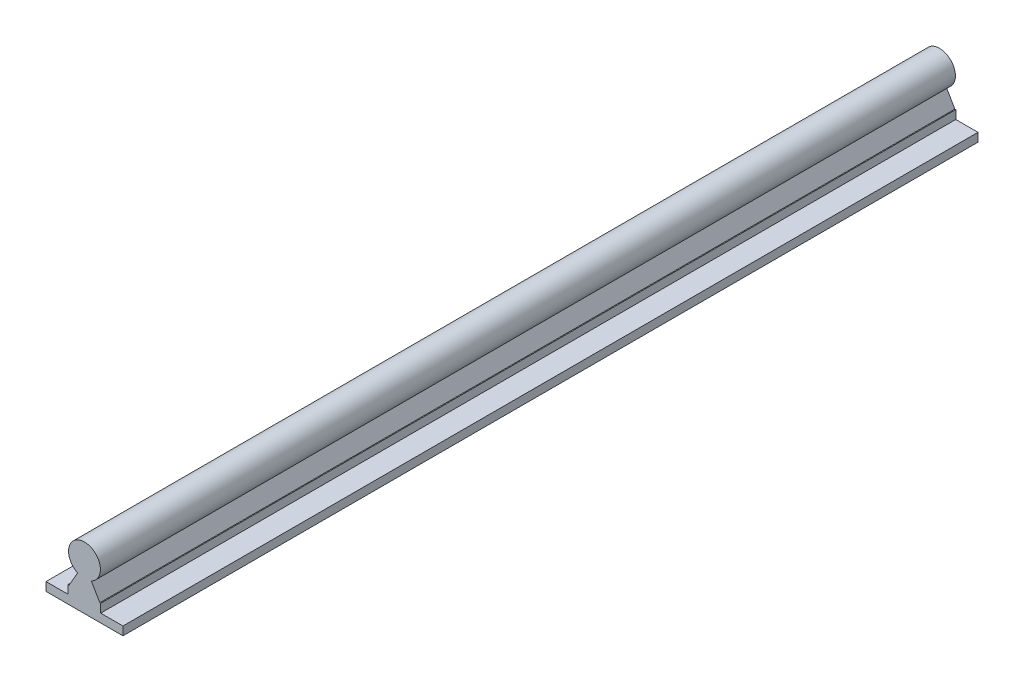
ISO-10303-21;
HEADER;
FILE_DESCRIPTION(('STEP AP214'),'2;1');
FILE_NAME('part.step','',(''),(''),'','','');
FILE_SCHEMA(('AUTOMOTIVE_DESIGN { 1 0 10303 214 1 1 1 1 }'));
ENDSEC;
DATA;
#1=APPLICATION_CONTEXT('core data for automotive mechanical design processes');
#2=APPLICATION_PROTOCOL_DEFINITION('international standard','automotive_design',2000,#1);
#3=PRODUCT_CONTEXT('',#1,'mechanical');
#4=PRODUCT('Part','Part','',(#3));
#5=PRODUCT_RELATED_PRODUCT_CATEGORY('part','',(#4));
#6=PRODUCT_DEFINITION_FORMATION('','',#4);
#7=PRODUCT_DEFINITION_CONTEXT('part definition',#1,'design');
#8=PRODUCT_DEFINITION('design','',#6,#7);
#9=PRODUCT_DEFINITION_SHAPE('','',#8);
#10=(LENGTH_UNIT() NAMED_UNIT(*) SI_UNIT(.MILLI.,.METRE.));
#11=(NAMED_UNIT(*) PLANE_ANGLE_UNIT() SI_UNIT($,.RADIAN.));
#12=(NAMED_UNIT(*) SI_UNIT($,.STERADIAN.) SOLID_ANGLE_UNIT());
#13=UNCERTAINTY_MEASURE_WITH_UNIT(LENGTH_MEASURE(1.E-05),#10,'distance_accuracy_value','');
#14=(GEOMETRIC_REPRESENTATION_CONTEXT(3) GLOBAL_UNCERTAINTY_ASSIGNED_CONTEXT((#13)) GLOBAL_UNIT_ASSIGNED_CONTEXT((#10,
#11,#12)) REPRESENTATION_CONTEXT('',''));
#15=CARTESIAN_POINT('',(0.,0.,0.));
#16=DIRECTION('',(0.,0.,1.));
#17=DIRECTION('',(1.,0.,0.));
#18=AXIS2_PLACEMENT_3D('',#15,#16,#17);
#19=CARTESIAN_POINT('',(-22.5,5.,500.));
#20=DIRECTION('',(1.,0.,0.));
#21=DIRECTION('',(0.,0.,-1.));
#22=AXIS2_PLACEMENT_3D('',#19,#20,#21);
#23=PLANE('',#22);
#24=DIRECTION('',(0.,-1.,0.));
#25=VECTOR('',#24,1.);
#26=CARTESIAN_POINT('',(-22.5,5.,0.));
#27=LINE('',#26,#25);
#28=CARTESIAN_POINT('',(-22.5,5.,0.));
#29=VERTEX_POINT('',#28);
#30=CARTESIAN_POINT('',(-22.5,0.,0.));
#31=VERTEX_POINT('',#30);
#32=EDGE_CURVE('E153',#29,#31,#27,.T.);
#33=ORIENTED_EDGE('',*,*,#32,.T.);
#34=DIRECTION('',(0.,0.,-1.));
#35=VECTOR('',#34,1.);
#36=CARTESIAN_POINT('',(-22.5,0.,500.));
#37=LINE('',#36,#35);
#38=CARTESIAN_POINT('',(-22.5,0.,500.));
#39=VERTEX_POINT('',#38);
#40=EDGE_CURVE('E11',#39,#31,#37,.T.);
#41=ORIENTED_EDGE('',*,*,#40,.F.);
#42=DIRECTION('',(0.,-1.,0.));
#43=VECTOR('',#42,1.);
#44=CARTESIAN_POINT('',(-22.5,5.,500.));
#45=LINE('',#44,#43);
#46=CARTESIAN_POINT('',(-22.5,5.,500.));
#47=VERTEX_POINT('',#46);
#48=EDGE_CURVE('E175',#47,#39,#45,.T.);
#49=ORIENTED_EDGE('',*,*,#48,.F.);
#50=DIRECTION('',(0.,0.,-1.));
#51=VECTOR('',#50,1.);
#52=CARTESIAN_POINT('',(-22.5,5.,500.));
#53=LINE('',#52,#51);
#54=EDGE_CURVE('E149',#47,#29,#53,.T.);
#55=ORIENTED_EDGE('',*,*,#54,.T.);
#56=EDGE_LOOP('',(#33,#41,#49,#55));
#57=FACE_BOUND('',#56,.T.);
#58=ADVANCED_FACE('F33',(#57),#23,.F.);
#59=CARTESIAN_POINT('',(-22.5,0.,500.));
#60=DIRECTION('',(0.,1.,0.));
#61=DIRECTION('',(0.,0.,1.));
#62=AXIS2_PLACEMENT_3D('',#59,#60,#61);
#63=PLANE('',#62);
#64=DIRECTION('',(1.,0.,0.));
#65=VECTOR('',#64,1.);
#66=CARTESIAN_POINT('',(-22.5,0.,0.));
#67=LINE('',#66,#65);
#68=CARTESIAN_POINT('',(22.5,0.,0.));
#69=VERTEX_POINT('',#68);
#70=EDGE_CURVE('E156',#31,#69,#67,.T.);
#71=ORIENTED_EDGE('',*,*,#70,.T.);
#72=DIRECTION('',(0.,0.,-1.));
#73=VECTOR('',#72,1.);
#74=CARTESIAN_POINT('',(22.5,0.,500.));
#75=LINE('',#74,#73);
#76=CARTESIAN_POINT('',(22.5,0.,500.));
#77=VERTEX_POINT('',#76);
#78=EDGE_CURVE('E41',#77,#69,#75,.T.);
#79=ORIENTED_EDGE('',*,*,#78,.F.);
#80=DIRECTION('',(1.,0.,0.));
#81=VECTOR('',#80,1.);
#82=CARTESIAN_POINT('',(-22.5,0.,500.));
#83=LINE('',#82,#81);
#84=EDGE_CURVE('E104',#39,#77,#83,.T.);
#85=ORIENTED_EDGE('',*,*,#84,.F.);
#86=ORIENTED_EDGE('',*,*,#40,.T.);
#87=EDGE_LOOP('',(#71,#79,#85,#86));
#88=FACE_BOUND('',#87,.T.);
#89=ADVANCED_FACE('F253',(#88),#63,.F.);
#90=CARTESIAN_POINT('',(22.5,0.,500.));
#91=DIRECTION('',(-1.,0.,0.));
#92=DIRECTION('',(0.,0.,1.));
#93=AXIS2_PLACEMENT_3D('',#90,#91,#92);
#94=PLANE('',#93);
#95=DIRECTION('',(0.,1.,0.));
#96=VECTOR('',#95,1.);
#97=CARTESIAN_POINT('',(22.5,0.,0.));
#98=LINE('',#97,#96);
#99=CARTESIAN_POINT('',(22.5,5.,0.));
#100=VERTEX_POINT('',#99);
#101=EDGE_CURVE('E158',#69,#100,#98,.T.);
#102=ORIENTED_EDGE('',*,*,#101,.T.);
#103=DIRECTION('',(0.,0.,-1.));
#104=VECTOR('',#103,1.);
#105=CARTESIAN_POINT('',(22.5,5.,500.));
#106=LINE('',#105,#104);
#107=CARTESIAN_POINT('',(22.5,5.,500.));
#108=VERTEX_POINT('',#107);
#109=EDGE_CURVE('E194',#108,#100,#106,.T.);
#110=ORIENTED_EDGE('',*,*,#109,.F.);
#111=DIRECTION('',(0.,1.,0.));
#112=VECTOR('',#111,1.);
#113=CARTESIAN_POINT('',(22.5,0.,500.));
#114=LINE('',#113,#112);
#115=EDGE_CURVE('E202',#77,#108,#114,.T.);
#116=ORIENTED_EDGE('',*,*,#115,.F.);
#117=ORIENTED_EDGE('',*,*,#78,.T.);
#118=EDGE_LOOP('',(#102,#110,#116,#117));
#119=FACE_BOUND('',#118,.T.);
#120=ADVANCED_FACE('F200',(#119),#94,.F.);
#121=CARTESIAN_POINT('',(22.5,5.,500.));
#122=DIRECTION('',(0.,-1.,0.));
#123=DIRECTION('',(1.,0.,0.));
#124=AXIS2_PLACEMENT_3D('',#121,#122,#123);
#125=PLANE('',#124);
#126=DIRECTION('',(-1.,0.,0.));
#127=VECTOR('',#126,1.);
#128=CARTESIAN_POINT('',(22.5,5.,0.));
#129=LINE('',#128,#127);
#130=CARTESIAN_POINT('',(9.5,4.99999999999999,0.));
#131=VERTEX_POINT('',#130);
#132=EDGE_CURVE('E160',#100,#131,#129,.T.);
#133=ORIENTED_EDGE('',*,*,#132,.T.);
#134=DIRECTION('',(0.,0.,-1.));
#135=VECTOR('',#134,1.);
#136=CARTESIAN_POINT('',(9.5,4.99999999999999,500.));
#137=LINE('',#136,#135);
#138=CARTESIAN_POINT('',(9.5,4.99999999999999,500.));
#139=VERTEX_POINT('',#138);
#140=EDGE_CURVE('E191',#139,#131,#137,.T.);
#141=ORIENTED_EDGE('',*,*,#140,.F.);
#142=DIRECTION('',(-1.,0.,0.));
#143=VECTOR('',#142,1.);
#144=CARTESIAN_POINT('',(22.5,5.,500.));
#145=LINE('',#144,#143);
#146=EDGE_CURVE('E220',#108,#139,#145,.T.);
#147=ORIENTED_EDGE('',*,*,#146,.F.);
#148=ORIENTED_EDGE('',*,*,#109,.T.);
#149=EDGE_LOOP('',(#133,#141,#147,#148));
#150=FACE_BOUND('',#149,.T.);
#151=ADVANCED_FACE('F211',(#150),#125,.F.);
#152=CARTESIAN_POINT('',(9.5,4.99999999999999,500.));
#153=DIRECTION('',(-1.,0.,0.));
#154=DIRECTION('',(0.,-1.,0.));
#155=AXIS2_PLACEMENT_3D('',#152,#153,#154);
#156=PLANE('',#155);
#157=DIRECTION('',(0.,1.,0.));
#158=VECTOR('',#157,1.);
#159=CARTESIAN_POINT('',(9.5,4.99999999999999,0.));
#160=LINE('',#159,#158);
#161=CARTESIAN_POINT('',(9.5,9.99999999999999,0.));
#162=VERTEX_POINT('',#161);
#163=EDGE_CURVE('E162',#131,#162,#160,.T.);
#164=ORIENTED_EDGE('',*,*,#163,.T.);
#165=DIRECTION('',(0.,0.,-1.));
#166=VECTOR('',#165,1.);
#167=CARTESIAN_POINT('',(9.5,9.99999999999999,500.));
#168=LINE('',#167,#166);
#169=CARTESIAN_POINT('',(9.5,9.99999999999999,500.));
#170=VERTEX_POINT('',#169);
#171=EDGE_CURVE('E188',#170,#162,#168,.T.);
#172=ORIENTED_EDGE('',*,*,#171,.F.);
#173=DIRECTION('',(0.,1.,0.));
#174=VECTOR('',#173,1.);
#175=CARTESIAN_POINT('',(9.5,4.99999999999999,500.));
#176=LINE('',#175,#174);
#177=EDGE_CURVE('E217',#139,#170,#176,.T.);
#178=ORIENTED_EDGE('',*,*,#177,.F.);
#179=ORIENTED_EDGE('',*,*,#140,.T.);
#180=EDGE_LOOP('',(#164,#172,#178,#179));
#181=FACE_BOUND('',#180,.T.);
#182=ADVANCED_FACE('F215',(#181),#156,.F.);
#183=CARTESIAN_POINT('',(9.5,9.99999999999999,500.));
#184=DIRECTION('',(0.,-1.,0.));
#185=DIRECTION('',(1.,0.,0.));
#186=AXIS2_PLACEMENT_3D('',#183,#184,#185);
#187=PLANE('',#186);
#188=DIRECTION('',(-1.,0.,0.));
#189=VECTOR('',#188,1.);
#190=CARTESIAN_POINT('',(9.5,9.99999999999999,0.));
#191=LINE('',#190,#189);
#192=CARTESIAN_POINT('',(8.967618538082,9.99999999999999,0.));
#193=VERTEX_POINT('',#192);
#194=EDGE_CURVE('E164',#162,#193,#191,.T.);
#195=ORIENTED_EDGE('',*,*,#194,.T.);
#196=DIRECTION('',(0.,0.,-1.));
#197=VECTOR('',#196,1.);
#198=CARTESIAN_POINT('',(8.967618538082,9.99999999999999,500.));
#199=LINE('',#198,#197);
#200=CARTESIAN_POINT('',(8.967618538082,9.99999999999999,500.));
#201=VERTEX_POINT('',#200);
#202=EDGE_CURVE('E185',#201,#193,#199,.T.);
#203=ORIENTED_EDGE('',*,*,#202,.F.);
#204=DIRECTION('',(-1.,0.,0.));
#205=VECTOR('',#204,1.);
#206=CARTESIAN_POINT('',(9.5,9.99999999999999,500.));
#207=LINE('',#206,#205);
#208=EDGE_CURVE('E219',#170,#201,#207,.T.);
#209=ORIENTED_EDGE('',*,*,#208,.F.);
#210=ORIENTED_EDGE('',*,*,#171,.T.);
#211=EDGE_LOOP('',(#195,#203,#209,#210));
#212=FACE_BOUND('',#211,.T.);
#213=ADVANCED_FACE('F266',(#212),#187,.F.);
#214=CARTESIAN_POINT('',(8.967618538082,9.99999999999999,500.));
#215=DIRECTION('',(-0.866025403784439,-0.5,0.));
#216=DIRECTION('',(0.5,-0.866025403784439,0.));
#217=AXIS2_PLACEMENT_3D('',#214,#215,#216);
#218=PLANE('',#217);
#219=DIRECTION('',(-0.5,0.866025403784439,0.));
#220=VECTOR('',#219,1.);
#221=CARTESIAN_POINT('',(8.967618538082,9.99999999999999,0.));
#222=LINE('',#221,#220);
#223=CARTESIAN_POINT('',(4.,18.6041677005791,0.));
#224=VERTEX_POINT('',#223);
#225=EDGE_CURVE('E166',#193,#224,#222,.T.);
#226=ORIENTED_EDGE('',*,*,#225,.T.);
#227=DIRECTION('',(0.,0.,-1.));
#228=VECTOR('',#227,1.);
#229=CARTESIAN_POINT('',(4.,18.6041677005791,500.));
#230=LINE('',#229,#228);
#231=CARTESIAN_POINT('',(4.,18.6041677005791,500.));
#232=VERTEX_POINT('',#231);
#233=EDGE_CURVE('E182',#232,#224,#230,.T.);
#234=ORIENTED_EDGE('',*,*,#233,.F.);
#235=DIRECTION('',(-0.5,0.866025403784439,0.));
#236=VECTOR('',#235,1.);
#237=CARTESIAN_POINT('',(8.967618538082,9.99999999999999,500.));
#238=LINE('',#237,#236);
#239=EDGE_CURVE('E222',#201,#232,#238,.T.);
#240=ORIENTED_EDGE('',*,*,#239,.F.);
#241=ORIENTED_EDGE('',*,*,#202,.T.);
#242=EDGE_LOOP('',(#226,#234,#240,#241));
#243=FACE_BOUND('',#242,.T.);
#244=ADVANCED_FACE('F269',(#243),#218,.F.);
#245=CARTESIAN_POINT('',(0.,27.,500.));
#246=DIRECTION('',(0.,0.,-1.));
#247=DIRECTION('',(-1.,0.,0.));
#248=AXIS2_PLACEMENT_3D('',#245,#246,#247);
#249=CYLINDRICAL_SURFACE('',#248,9.3);
#250=CARTESIAN_POINT('',(0.,27.,0.));
#251=DIRECTION('',(0.,0.,1.));
#252=DIRECTION('',(1.,0.,0.));
#253=AXIS2_PLACEMENT_3D('',#250,#251,#252);
#254=CIRCLE('',#253,9.3);
#255=CARTESIAN_POINT('',(-4.00000000000001,18.6041677005791,0.));
#256=VERTEX_POINT('',#255);
#257=EDGE_CURVE('E168',#224,#256,#254,.T.);
#258=ORIENTED_EDGE('',*,*,#257,.T.);
#259=DIRECTION('',(0.,0.,-1.));
#260=VECTOR('',#259,1.);
#261=CARTESIAN_POINT('',(-4.00000000000001,18.6041677005791,500.));
#262=LINE('',#261,#260);
#263=CARTESIAN_POINT('',(-4.00000000000001,18.6041677005791,500.));
#264=VERTEX_POINT('',#263);
#265=EDGE_CURVE('E179',#264,#256,#262,.T.);
#266=ORIENTED_EDGE('',*,*,#265,.F.);
#267=CARTESIAN_POINT('',(0.,27.,500.));
#268=DIRECTION('',(0.,0.,1.));
#269=DIRECTION('',(1.,0.,0.));
#270=AXIS2_PLACEMENT_3D('',#267,#268,#269);
#271=CIRCLE('',#270,9.3);
#272=EDGE_CURVE('E228',#232,#264,#271,.T.);
#273=ORIENTED_EDGE('',*,*,#272,.F.);
#274=ORIENTED_EDGE('',*,*,#233,.T.);
#275=EDGE_LOOP('',(#258,#266,#273,#274));
#276=FACE_BOUND('',#275,.T.);
#277=ADVANCED_FACE('F234',(#276),#249,.T.);
#278=CARTESIAN_POINT('',(-4.00000000000001,18.6041677005791,500.));
#279=DIRECTION('',(0.866025403784439,-0.5,0.));
#280=DIRECTION('',(0.5,0.866025403784439,0.));
#281=AXIS2_PLACEMENT_3D('',#278,#279,#280);
#282=PLANE('',#281);
#283=DIRECTION('',(-0.5,-0.866025403784439,0.));
#284=VECTOR('',#283,1.);
#285=CARTESIAN_POINT('',(-4.00000000000001,18.6041677005791,0.));
#286=LINE('',#285,#284);
#287=CARTESIAN_POINT('',(-8.96761853808201,10.,0.));
#288=VERTEX_POINT('',#287);
#289=EDGE_CURVE('E170',#256,#288,#286,.T.);
#290=ORIENTED_EDGE('',*,*,#289,.T.);
#291=DIRECTION('',(0.,0.,-1.));
#292=VECTOR('',#291,1.);
#293=CARTESIAN_POINT('',(-8.96761853808201,10.,500.));
#294=LINE('',#293,#292);
#295=CARTESIAN_POINT('',(-8.96761853808201,10.,500.));
#296=VERTEX_POINT('',#295);
#297=EDGE_CURVE('E144',#296,#288,#294,.T.);
#298=ORIENTED_EDGE('',*,*,#297,.F.);
#299=DIRECTION('',(-0.5,-0.866025403784439,0.));
#300=VECTOR('',#299,1.);
#301=CARTESIAN_POINT('',(-4.00000000000001,18.6041677005791,500.));
#302=LINE('',#301,#300);
#303=EDGE_CURVE('E135',#264,#296,#302,.T.);
#304=ORIENTED_EDGE('',*,*,#303,.F.);
#305=ORIENTED_EDGE('',*,*,#265,.T.);
#306=EDGE_LOOP('',(#290,#298,#304,#305));
#307=FACE_BOUND('',#306,.T.);
#308=ADVANCED_FACE('F238',(#307),#282,.F.);
#309=CARTESIAN_POINT('',(-8.96761853808201,10.,500.));
#310=DIRECTION('',(0.,-1.,0.));
#311=DIRECTION('',(0.,0.,-1.));
#312=AXIS2_PLACEMENT_3D('',#309,#310,#311);
#313=PLANE('',#312);
#314=DIRECTION('',(-1.,0.,0.));
#315=VECTOR('',#314,1.);
#316=CARTESIAN_POINT('',(-8.96761853808201,10.,0.));
#317=LINE('',#316,#315);
#318=CARTESIAN_POINT('',(-9.50000000000001,10.,0.));
#319=VERTEX_POINT('',#318);
#320=EDGE_CURVE('E143',#288,#319,#317,.T.);
#321=ORIENTED_EDGE('',*,*,#320,.T.);
#322=DIRECTION('',(0.,0.,-1.));
#323=VECTOR('',#322,1.);
#324=CARTESIAN_POINT('',(-9.50000000000001,10.,500.));
#325=LINE('',#324,#323);
#326=CARTESIAN_POINT('',(-9.50000000000001,10.,500.));
#327=VERTEX_POINT('',#326);
#328=EDGE_CURVE('E140',#327,#319,#325,.T.);
#329=ORIENTED_EDGE('',*,*,#328,.F.);
#330=DIRECTION('',(-1.,0.,0.));
#331=VECTOR('',#330,1.);
#332=CARTESIAN_POINT('',(-8.96761853808201,10.,500.));
#333=LINE('',#332,#331);
#334=EDGE_CURVE('E129',#296,#327,#333,.T.);
#335=ORIENTED_EDGE('',*,*,#334,.F.);
#336=ORIENTED_EDGE('',*,*,#297,.T.);
#337=EDGE_LOOP('',(#321,#329,#335,#336));
#338=FACE_BOUND('',#337,.T.);
#339=ADVANCED_FACE('F141',(#338),#313,.F.);
#340=CARTESIAN_POINT('',(-9.50000000000001,10.,500.));
#341=DIRECTION('',(1.,0.,0.));
#342=DIRECTION('',(0.,1.,0.));
#343=AXIS2_PLACEMENT_3D('',#340,#341,#342);
#344=PLANE('',#343);
#345=DIRECTION('',(0.,-1.,0.));
#346=VECTOR('',#345,1.);
#347=CARTESIAN_POINT('',(-9.50000000000001,10.,0.));
#348=LINE('',#347,#346);
#349=CARTESIAN_POINT('',(-9.5,5.,0.));
#350=VERTEX_POINT('',#349);
#351=EDGE_CURVE('E90',#319,#350,#348,.T.);
#352=ORIENTED_EDGE('',*,*,#351,.T.);
#353=DIRECTION('',(0.,0.,-1.));
#354=VECTOR('',#353,1.);
#355=CARTESIAN_POINT('',(-9.5,5.,500.));
#356=LINE('',#355,#354);
#357=CARTESIAN_POINT('',(-9.5,5.,500.));
#358=VERTEX_POINT('',#357);
#359=EDGE_CURVE('E145',#358,#350,#356,.T.);
#360=ORIENTED_EDGE('',*,*,#359,.F.);
#361=DIRECTION('',(0.,-1.,0.));
#362=VECTOR('',#361,1.);
#363=CARTESIAN_POINT('',(-9.50000000000001,10.,500.));
#364=LINE('',#363,#362);
#365=EDGE_CURVE('E133',#327,#358,#364,.T.);
#366=ORIENTED_EDGE('',*,*,#365,.F.);
#367=ORIENTED_EDGE('',*,*,#328,.T.);
#368=EDGE_LOOP('',(#352,#360,#366,#367));
#369=FACE_BOUND('',#368,.T.);
#370=ADVANCED_FACE('F147',(#369),#344,.F.);
#371=CARTESIAN_POINT('',(-9.5,5.,500.));
#372=DIRECTION('',(0.,-1.,0.));
#373=DIRECTION('',(1.,0.,0.));
#374=AXIS2_PLACEMENT_3D('',#371,#372,#373);
#375=PLANE('',#374);
#376=DIRECTION('',(-1.,0.,0.));
#377=VECTOR('',#376,1.);
#378=CARTESIAN_POINT('',(-9.5,5.,0.));
#379=LINE('',#378,#377);
#380=EDGE_CURVE('E96',#350,#29,#379,.T.);
#381=ORIENTED_EDGE('',*,*,#380,.T.);
#382=ORIENTED_EDGE('',*,*,#54,.F.);
#383=DIRECTION('',(-1.,0.,0.));
#384=VECTOR('',#383,1.);
#385=CARTESIAN_POINT('',(-9.5,5.,500.));
#386=LINE('',#385,#384);
#387=EDGE_CURVE('E49',#358,#47,#386,.T.);
#388=ORIENTED_EDGE('',*,*,#387,.F.);
#389=ORIENTED_EDGE('',*,*,#359,.T.);
#390=EDGE_LOOP('',(#381,#382,#388,#389));
#391=FACE_BOUND('',#390,.T.);
#392=ADVANCED_FACE('F242',(#391),#375,.F.);
#393=CARTESIAN_POINT('',(0.,27.,500.));
#394=DIRECTION('',(0.,0.,1.));
#395=DIRECTION('',(1.,0.,0.));
#396=AXIS2_PLACEMENT_3D('',#393,#394,#395);
#397=PLANE('',#396);
#398=ORIENTED_EDGE('',*,*,#48,.T.);
#399=ORIENTED_EDGE('',*,*,#84,.T.);
#400=ORIENTED_EDGE('',*,*,#115,.T.);
#401=ORIENTED_EDGE('',*,*,#146,.T.);
#402=ORIENTED_EDGE('',*,*,#177,.T.);
#403=ORIENTED_EDGE('',*,*,#208,.T.);
#404=ORIENTED_EDGE('',*,*,#239,.T.);
#405=ORIENTED_EDGE('',*,*,#272,.T.);
#406=ORIENTED_EDGE('',*,*,#303,.T.);
#407=ORIENTED_EDGE('',*,*,#334,.T.);
#408=ORIENTED_EDGE('',*,*,#365,.T.);
#409=ORIENTED_EDGE('',*,*,#387,.T.);
#410=EDGE_LOOP('',(#398,#399,#400,#401,#402,#403,#404,#405,#406,#407,#408,#409));
#411=FACE_BOUND('',#410,.T.);
#412=ADVANCED_FACE('F131',(#411),#397,.T.);
#413=CARTESIAN_POINT('',(0.,27.,0.));
#414=DIRECTION('',(0.,0.,1.));
#415=DIRECTION('',(1.,0.,0.));
#416=AXIS2_PLACEMENT_3D('',#413,#414,#415);
#417=PLANE('',#416);
#418=ORIENTED_EDGE('',*,*,#32,.F.);
#419=ORIENTED_EDGE('',*,*,#380,.F.);
#420=ORIENTED_EDGE('',*,*,#351,.F.);
#421=ORIENTED_EDGE('',*,*,#320,.F.);
#422=ORIENTED_EDGE('',*,*,#289,.F.);
#423=ORIENTED_EDGE('',*,*,#257,.F.);
#424=ORIENTED_EDGE('',*,*,#225,.F.);
#425=ORIENTED_EDGE('',*,*,#194,.F.);
#426=ORIENTED_EDGE('',*,*,#163,.F.);
#427=ORIENTED_EDGE('',*,*,#132,.F.);
#428=ORIENTED_EDGE('',*,*,#101,.F.);
#429=ORIENTED_EDGE('',*,*,#70,.F.);
#430=EDGE_LOOP('',(#418,#419,#420,#421,#422,#423,#424,#425,#426,#427,#428,#429));
#431=FACE_BOUND('',#430,.T.);
#432=ADVANCED_FACE('F206',(#431),#417,.F.);
#433=CLOSED_SHELL('',(#58,#89,#120,#151,#182,#213,#244,#277,#308,#339,#370,#392,#412,#432));
#434=MANIFOLD_SOLID_BREP('B2',#433);
#435=ADVANCED_BREP_SHAPE_REPRESENTATION('',(#18,#434),#14);
#436=SHAPE_DEFINITION_REPRESENTATION(#9,#435);
ENDSEC;
END-ISO-10303-21;
